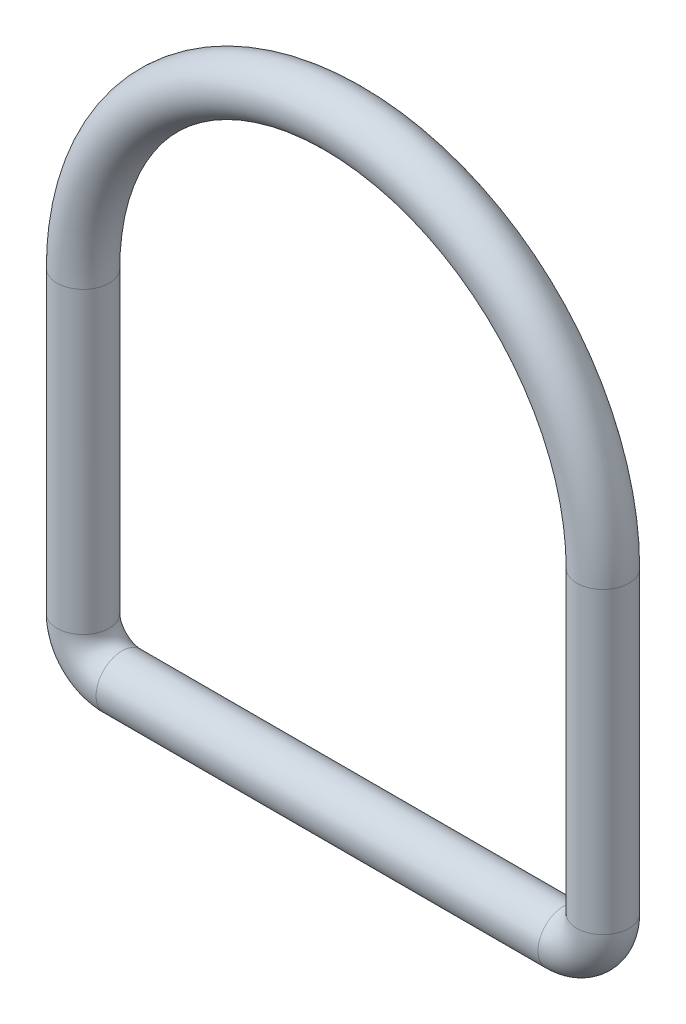
ISO-10303-21;
HEADER;
FILE_DESCRIPTION(('STEP AP214'),'2;1');
FILE_NAME('part.step','',(''),(''),'','','');
FILE_SCHEMA(('AUTOMOTIVE_DESIGN { 1 0 10303 214 1 1 1 1 }'));
ENDSEC;
DATA;
#1=APPLICATION_CONTEXT('core data for automotive mechanical design processes');
#2=APPLICATION_PROTOCOL_DEFINITION('international standard','automotive_design',2000,#1);
#3=PRODUCT_CONTEXT('',#1,'mechanical');
#4=PRODUCT('Part','Part','',(#3));
#5=PRODUCT_RELATED_PRODUCT_CATEGORY('part','',(#4));
#6=PRODUCT_DEFINITION_FORMATION('','',#4);
#7=PRODUCT_DEFINITION_CONTEXT('part definition',#1,'design');
#8=PRODUCT_DEFINITION('design','',#6,#7);
#9=PRODUCT_DEFINITION_SHAPE('','',#8);
#10=(LENGTH_UNIT() NAMED_UNIT(*) SI_UNIT(.MILLI.,.METRE.));
#11=(NAMED_UNIT(*) PLANE_ANGLE_UNIT() SI_UNIT($,.RADIAN.));
#12=(NAMED_UNIT(*) SI_UNIT($,.STERADIAN.) SOLID_ANGLE_UNIT());
#13=UNCERTAINTY_MEASURE_WITH_UNIT(LENGTH_MEASURE(1.E-05),#10,'distance_accuracy_value','');
#14=(GEOMETRIC_REPRESENTATION_CONTEXT(3) GLOBAL_UNCERTAINTY_ASSIGNED_CONTEXT((#13)) GLOBAL_UNIT_ASSIGNED_CONTEXT((#10,
#11,#12)) REPRESENTATION_CONTEXT('',''));
#15=CARTESIAN_POINT('',(0.,0.,0.));
#16=DIRECTION('',(0.,0.,1.));
#17=DIRECTION('',(1.,0.,0.));
#18=AXIS2_PLACEMENT_3D('',#15,#16,#17);
#19=CARTESIAN_POINT('',(8.5,36.5,0.));
#20=DIRECTION('',(0.,0.,1.));
#21=DIRECTION('',(1.,0.,0.));
#22=AXIS2_PLACEMENT_3D('',#19,#20,#21);
#23=TOROIDAL_SURFACE('',#22,1.5,1.);
#24=CARTESIAN_POINT('',(8.5,35.,0.));
#25=DIRECTION('',(1.,0.,0.));
#26=DIRECTION('',(0.,0.,-1.));
#27=AXIS2_PLACEMENT_3D('',#24,#25,#26);
#28=CIRCLE('',#27,1.);
#29=CARTESIAN_POINT('',(8.5,35.,-1.));
#30=VERTEX_POINT('',#29);
#31=EDGE_CURVE('E48',#30,#30,#28,.T.);
#32=ORIENTED_EDGE('',*,*,#31,.T.);
#33=EDGE_LOOP('',(#32));
#34=FACE_BOUND('',#33,.T.);
#35=CARTESIAN_POINT('',(10.,36.5,0.));
#36=DIRECTION('',(0.,1.,0.));
#37=DIRECTION('',(0.,0.,-1.));
#38=AXIS2_PLACEMENT_3D('',#35,#36,#37);
#39=CIRCLE('',#38,1.);
#40=CARTESIAN_POINT('',(10.,36.5,-1.));
#41=VERTEX_POINT('',#40);
#42=EDGE_CURVE('E11',#41,#41,#39,.T.);
#43=ORIENTED_EDGE('',*,*,#42,.F.);
#44=EDGE_LOOP('',(#43));
#45=FACE_BOUND('',#44,.T.);
#46=ADVANCED_FACE('F17',(#34,#45),#23,.T.);
#47=CARTESIAN_POINT('',(-8.5,36.5,0.));
#48=DIRECTION('',(0.,0.,1.));
#49=DIRECTION('',(1.,0.,0.));
#50=AXIS2_PLACEMENT_3D('',#47,#48,#49);
#51=TOROIDAL_SURFACE('',#50,1.5,1.);
#52=CARTESIAN_POINT('',(-10.,36.5,0.));
#53=DIRECTION('',(0.,1.,0.));
#54=DIRECTION('',(0.,0.,1.));
#55=AXIS2_PLACEMENT_3D('',#52,#53,#54);
#56=CIRCLE('',#55,1.);
#57=CARTESIAN_POINT('',(-10.,36.5,1.));
#58=VERTEX_POINT('',#57);
#59=EDGE_CURVE('E24',#58,#58,#56,.T.);
#60=ORIENTED_EDGE('',*,*,#59,.F.);
#61=EDGE_LOOP('',(#60));
#62=FACE_BOUND('',#61,.T.);
#63=CARTESIAN_POINT('',(-8.5,35.,0.));
#64=DIRECTION('',(1.,0.,0.));
#65=DIRECTION('',(0.,0.,-1.));
#66=AXIS2_PLACEMENT_3D('',#63,#64,#65);
#67=CIRCLE('',#66,1.);
#68=CARTESIAN_POINT('',(-8.5,35.,-1.));
#69=VERTEX_POINT('',#68);
#70=EDGE_CURVE('E45',#69,#69,#67,.T.);
#71=ORIENTED_EDGE('',*,*,#70,.F.);
#72=EDGE_LOOP('',(#71));
#73=FACE_BOUND('',#72,.T.);
#74=ADVANCED_FACE('F63',(#62,#73),#51,.T.);
#75=CARTESIAN_POINT('',(10.,48.,0.));
#76=DIRECTION('',(0.,1.,0.));
#77=DIRECTION('',(0.,0.,-1.));
#78=AXIS2_PLACEMENT_3D('',#75,#76,#77);
#79=CYLINDRICAL_SURFACE('',#78,1.);
#80=CARTESIAN_POINT('',(10.,48.,0.));
#81=DIRECTION('',(0.,1.,0.));
#82=DIRECTION('',(0.,0.,-1.));
#83=AXIS2_PLACEMENT_3D('',#80,#81,#82);
#84=CIRCLE('',#83,1.);
#85=CARTESIAN_POINT('',(10.,48.,-1.));
#86=VERTEX_POINT('',#85);
#87=EDGE_CURVE('E53',#86,#86,#84,.T.);
#88=ORIENTED_EDGE('',*,*,#87,.F.);
#89=EDGE_LOOP('',(#88));
#90=FACE_BOUND('',#89,.T.);
#91=ORIENTED_EDGE('',*,*,#42,.T.);
#92=EDGE_LOOP('',(#91));
#93=FACE_BOUND('',#92,.T.);
#94=ADVANCED_FACE('F60',(#90,#93),#79,.T.);
#95=CARTESIAN_POINT('',(-10.,48.,0.));
#96=DIRECTION('',(0.,1.,0.));
#97=DIRECTION('',(0.,0.,-1.));
#98=AXIS2_PLACEMENT_3D('',#95,#96,#97);
#99=CYLINDRICAL_SURFACE('',#98,1.);
#100=CARTESIAN_POINT('',(-10.,48.,0.));
#101=DIRECTION('',(0.,1.,0.));
#102=DIRECTION('',(0.,0.,1.));
#103=AXIS2_PLACEMENT_3D('',#100,#101,#102);
#104=CIRCLE('',#103,1.);
#105=CARTESIAN_POINT('',(-10.,48.,1.));
#106=VERTEX_POINT('',#105);
#107=EDGE_CURVE('E50',#106,#106,#104,.T.);
#108=ORIENTED_EDGE('',*,*,#107,.F.);
#109=EDGE_LOOP('',(#108));
#110=FACE_BOUND('',#109,.T.);
#111=ORIENTED_EDGE('',*,*,#59,.T.);
#112=EDGE_LOOP('',(#111));
#113=FACE_BOUND('',#112,.T.);
#114=ADVANCED_FACE('F62',(#110,#113),#99,.T.);
#115=CARTESIAN_POINT('',(0.,48.,0.));
#116=DIRECTION('',(0.,0.,1.));
#117=DIRECTION('',(1.,0.,0.));
#118=AXIS2_PLACEMENT_3D('',#115,#116,#117);
#119=TOROIDAL_SURFACE('',#118,10.,1.);
#120=ORIENTED_EDGE('',*,*,#87,.T.);
#121=EDGE_LOOP('',(#120));
#122=FACE_BOUND('',#121,.T.);
#123=ORIENTED_EDGE('',*,*,#107,.T.);
#124=EDGE_LOOP('',(#123));
#125=FACE_BOUND('',#124,.T.);
#126=ADVANCED_FACE('F57',(#122,#125),#119,.T.);
#127=CARTESIAN_POINT('',(8.5,35.,0.));
#128=DIRECTION('',(1.,0.,0.));
#129=DIRECTION('',(0.,0.,1.));
#130=AXIS2_PLACEMENT_3D('',#127,#128,#129);
#131=CYLINDRICAL_SURFACE('',#130,1.);
#132=ORIENTED_EDGE('',*,*,#31,.F.);
#133=EDGE_LOOP('',(#132));
#134=FACE_BOUND('',#133,.T.);
#135=ORIENTED_EDGE('',*,*,#70,.T.);
#136=EDGE_LOOP('',(#135));
#137=FACE_BOUND('',#136,.T.);
#138=ADVANCED_FACE('F46',(#134,#137),#131,.T.);
#139=CLOSED_SHELL('',(#46,#74,#94,#114,#126,#138));
#140=MANIFOLD_SOLID_BREP('B1',#139);
#141=ADVANCED_BREP_SHAPE_REPRESENTATION('',(#18,#140),#14);
#142=SHAPE_DEFINITION_REPRESENTATION(#9,#141);
ENDSEC;
END-ISO-10303-21;
